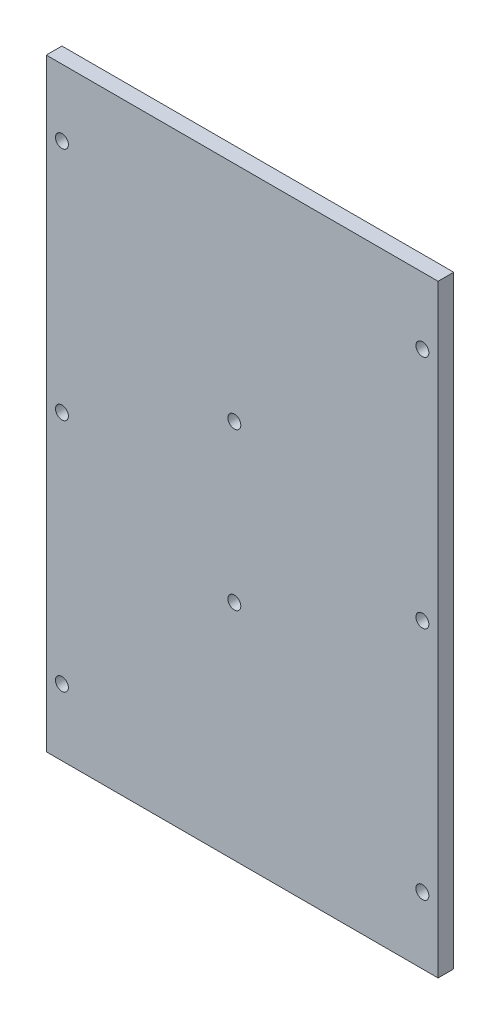
ISO-10303-21;
HEADER;
FILE_DESCRIPTION(('STEP AP214'),'2;1');
FILE_NAME('part.step','',(''),(''),'','','');
FILE_SCHEMA(('AUTOMOTIVE_DESIGN { 1 0 10303 214 1 1 1 1 }'));
ENDSEC;
DATA;
#1=APPLICATION_CONTEXT('core data for automotive mechanical design processes');
#2=APPLICATION_PROTOCOL_DEFINITION('international standard','automotive_design',2000,#1);
#3=PRODUCT_CONTEXT('',#1,'mechanical');
#4=PRODUCT('Part','Part','',(#3));
#5=PRODUCT_RELATED_PRODUCT_CATEGORY('part','',(#4));
#6=PRODUCT_DEFINITION_FORMATION('','',#4);
#7=PRODUCT_DEFINITION_CONTEXT('part definition',#1,'design');
#8=PRODUCT_DEFINITION('design','',#6,#7);
#9=PRODUCT_DEFINITION_SHAPE('','',#8);
#10=(LENGTH_UNIT() NAMED_UNIT(*) SI_UNIT(.MILLI.,.METRE.));
#11=(NAMED_UNIT(*) PLANE_ANGLE_UNIT() SI_UNIT($,.RADIAN.));
#12=(NAMED_UNIT(*) SI_UNIT($,.STERADIAN.) SOLID_ANGLE_UNIT());
#13=UNCERTAINTY_MEASURE_WITH_UNIT(LENGTH_MEASURE(1.E-05),#10,'distance_accuracy_value','');
#14=(GEOMETRIC_REPRESENTATION_CONTEXT(3) GLOBAL_UNCERTAINTY_ASSIGNED_CONTEXT((#13)) GLOBAL_UNIT_ASSIGNED_CONTEXT((#10,
#11,#12)) REPRESENTATION_CONTEXT('',''));
#15=CARTESIAN_POINT('',(0.,0.,0.));
#16=DIRECTION('',(0.,0.,1.));
#17=DIRECTION('',(1.,0.,0.));
#18=AXIS2_PLACEMENT_3D('',#15,#16,#17);
#19=CARTESIAN_POINT('',(-3.99999999999999,77.,4.));
#20=DIRECTION('',(0.,0.,-1.));
#21=DIRECTION('',(-1.,0.,0.));
#22=AXIS2_PLACEMENT_3D('',#19,#20,#21);
#23=CYLINDRICAL_SURFACE('',#22,1.65);
#24=CARTESIAN_POINT('',(-3.99999999999999,77.,4.));
#25=DIRECTION('',(0.,0.,-1.));
#26=DIRECTION('',(-1.,0.,0.));
#27=AXIS2_PLACEMENT_3D('',#24,#25,#26);
#28=CIRCLE('',#27,1.65);
#29=CARTESIAN_POINT('',(-5.64999999999999,77.,4.));
#30=VERTEX_POINT('',#29);
#31=EDGE_CURVE('E115',#30,#30,#28,.T.);
#32=ORIENTED_EDGE('',*,*,#31,.F.);
#33=EDGE_LOOP('',(#32));
#34=FACE_BOUND('',#33,.T.);
#35=CARTESIAN_POINT('',(-3.99999999999999,77.,1.5));
#36=DIRECTION('',(0.,0.,-1.));
#37=DIRECTION('',(-1.,0.,0.));
#38=AXIS2_PLACEMENT_3D('',#35,#36,#37);
#39=CIRCLE('',#38,1.65);
#40=CARTESIAN_POINT('',(-5.64999999999999,77.,1.5));
#41=VERTEX_POINT('',#40);
#42=EDGE_CURVE('E43',#41,#41,#39,.F.);
#43=ORIENTED_EDGE('',*,*,#42,.F.);
#44=EDGE_LOOP('',(#43));
#45=FACE_BOUND('',#44,.T.);
#46=ADVANCED_FACE('F39',(#34,#45),#23,.F.);
#47=CARTESIAN_POINT('',(-96.,17.,4.));
#48=DIRECTION('',(0.,0.,-1.));
#49=DIRECTION('',(-1.,0.,0.));
#50=AXIS2_PLACEMENT_3D('',#47,#48,#49);
#51=CYLINDRICAL_SURFACE('',#50,1.65);
#52=CARTESIAN_POINT('',(-96.,17.,4.));
#53=DIRECTION('',(0.,0.,-1.));
#54=DIRECTION('',(-1.,0.,0.));
#55=AXIS2_PLACEMENT_3D('',#52,#53,#54);
#56=CIRCLE('',#55,1.65);
#57=CARTESIAN_POINT('',(-97.65,17.,4.));
#58=VERTEX_POINT('',#57);
#59=EDGE_CURVE('E167',#58,#58,#56,.T.);
#60=ORIENTED_EDGE('',*,*,#59,.F.);
#61=EDGE_LOOP('',(#60));
#62=FACE_BOUND('',#61,.T.);
#63=CARTESIAN_POINT('',(-96.,17.,1.5));
#64=DIRECTION('',(0.,0.,-1.));
#65=DIRECTION('',(-1.,0.,0.));
#66=AXIS2_PLACEMENT_3D('',#63,#64,#65);
#67=CIRCLE('',#66,1.65);
#68=CARTESIAN_POINT('',(-97.65,17.,1.5));
#69=VERTEX_POINT('',#68);
#70=EDGE_CURVE('E137',#69,#69,#67,.F.);
#71=ORIENTED_EDGE('',*,*,#70,.F.);
#72=EDGE_LOOP('',(#71));
#73=FACE_BOUND('',#72,.T.);
#74=ADVANCED_FACE('F186',(#62,#73),#51,.F.);
#75=CARTESIAN_POINT('',(-52.,97.,4.));
#76=DIRECTION('',(0.,0.,-1.));
#77=DIRECTION('',(-1.,0.,0.));
#78=AXIS2_PLACEMENT_3D('',#75,#76,#77);
#79=CYLINDRICAL_SURFACE('',#78,1.65);
#80=CARTESIAN_POINT('',(-52.,97.,4.));
#81=DIRECTION('',(0.,0.,-1.));
#82=DIRECTION('',(-1.,0.,0.));
#83=AXIS2_PLACEMENT_3D('',#80,#81,#82);
#84=CIRCLE('',#83,1.65);
#85=CARTESIAN_POINT('',(-53.65,97.,4.));
#86=VERTEX_POINT('',#85);
#87=EDGE_CURVE('E164',#86,#86,#84,.T.);
#88=ORIENTED_EDGE('',*,*,#87,.F.);
#89=EDGE_LOOP('',(#88));
#90=FACE_BOUND('',#89,.T.);
#91=CARTESIAN_POINT('',(-52.,97.,1.5));
#92=DIRECTION('',(0.,0.,-1.));
#93=DIRECTION('',(-1.,0.,0.));
#94=AXIS2_PLACEMENT_3D('',#91,#92,#93);
#95=CIRCLE('',#94,1.65);
#96=CARTESIAN_POINT('',(-53.65,97.,1.5));
#97=VERTEX_POINT('',#96);
#98=EDGE_CURVE('E136',#97,#97,#95,.F.);
#99=ORIENTED_EDGE('',*,*,#98,.F.);
#100=EDGE_LOOP('',(#99));
#101=FACE_BOUND('',#100,.T.);
#102=ADVANCED_FACE('F194',(#90,#101),#79,.F.);
#103=CARTESIAN_POINT('',(-52.,57.,4.));
#104=DIRECTION('',(0.,0.,-1.));
#105=DIRECTION('',(-1.,0.,0.));
#106=AXIS2_PLACEMENT_3D('',#103,#104,#105);
#107=CYLINDRICAL_SURFACE('',#106,1.65);
#108=CARTESIAN_POINT('',(-52.,57.,4.));
#109=DIRECTION('',(0.,0.,-1.));
#110=DIRECTION('',(-1.,0.,0.));
#111=AXIS2_PLACEMENT_3D('',#108,#109,#110);
#112=CIRCLE('',#111,1.65);
#113=CARTESIAN_POINT('',(-53.65,57.,4.));
#114=VERTEX_POINT('',#113);
#115=EDGE_CURVE('E165',#114,#114,#112,.T.);
#116=ORIENTED_EDGE('',*,*,#115,.F.);
#117=EDGE_LOOP('',(#116));
#118=FACE_BOUND('',#117,.T.);
#119=CARTESIAN_POINT('',(-52.,57.,1.5));
#120=DIRECTION('',(0.,0.,-1.));
#121=DIRECTION('',(-1.,0.,0.));
#122=AXIS2_PLACEMENT_3D('',#119,#120,#121);
#123=CIRCLE('',#122,1.65);
#124=CARTESIAN_POINT('',(-53.65,57.,1.5));
#125=VERTEX_POINT('',#124);
#126=EDGE_CURVE('E135',#125,#125,#123,.F.);
#127=ORIENTED_EDGE('',*,*,#126,.F.);
#128=EDGE_LOOP('',(#127));
#129=FACE_BOUND('',#128,.T.);
#130=ADVANCED_FACE('F244',(#118,#129),#107,.F.);
#131=CARTESIAN_POINT('',(-96.,77.,4.));
#132=DIRECTION('',(0.,0.,-1.));
#133=DIRECTION('',(-1.,0.,0.));
#134=AXIS2_PLACEMENT_3D('',#131,#132,#133);
#135=CYLINDRICAL_SURFACE('',#134,1.65);
#136=CARTESIAN_POINT('',(-96.,77.,4.));
#137=DIRECTION('',(0.,0.,-1.));
#138=DIRECTION('',(-1.,0.,0.));
#139=AXIS2_PLACEMENT_3D('',#136,#137,#138);
#140=CIRCLE('',#139,1.65);
#141=CARTESIAN_POINT('',(-97.65,77.,4.));
#142=VERTEX_POINT('',#141);
#143=EDGE_CURVE('E166',#142,#142,#140,.T.);
#144=ORIENTED_EDGE('',*,*,#143,.F.);
#145=EDGE_LOOP('',(#144));
#146=FACE_BOUND('',#145,.T.);
#147=CARTESIAN_POINT('',(-96.,77.,1.5));
#148=DIRECTION('',(0.,0.,-1.));
#149=DIRECTION('',(-1.,0.,0.));
#150=AXIS2_PLACEMENT_3D('',#147,#148,#149);
#151=CIRCLE('',#150,1.65);
#152=CARTESIAN_POINT('',(-97.65,77.,1.5));
#153=VERTEX_POINT('',#152);
#154=EDGE_CURVE('E128',#153,#153,#151,.F.);
#155=ORIENTED_EDGE('',*,*,#154,.F.);
#156=EDGE_LOOP('',(#155));
#157=FACE_BOUND('',#156,.T.);
#158=ADVANCED_FACE('F199',(#146,#157),#135,.F.);
#159=CARTESIAN_POINT('',(-96.,137.,4.));
#160=DIRECTION('',(0.,0.,-1.));
#161=DIRECTION('',(-1.,0.,0.));
#162=AXIS2_PLACEMENT_3D('',#159,#160,#161);
#163=CYLINDRICAL_SURFACE('',#162,1.65000000000001);
#164=CARTESIAN_POINT('',(-96.,137.,4.));
#165=DIRECTION('',(0.,0.,-1.));
#166=DIRECTION('',(-1.,0.,0.));
#167=AXIS2_PLACEMENT_3D('',#164,#165,#166);
#168=CIRCLE('',#167,1.65000000000001);
#169=CARTESIAN_POINT('',(-97.65,137.,4.));
#170=VERTEX_POINT('',#169);
#171=EDGE_CURVE('E177',#170,#170,#168,.T.);
#172=ORIENTED_EDGE('',*,*,#171,.F.);
#173=EDGE_LOOP('',(#172));
#174=FACE_BOUND('',#173,.T.);
#175=CARTESIAN_POINT('',(-96.,137.,1.5));
#176=DIRECTION('',(0.,0.,-1.));
#177=DIRECTION('',(-1.,0.,0.));
#178=AXIS2_PLACEMENT_3D('',#175,#176,#177);
#179=CIRCLE('',#178,1.65000000000001);
#180=CARTESIAN_POINT('',(-97.65,137.,1.5));
#181=VERTEX_POINT('',#180);
#182=EDGE_CURVE('E130',#181,#181,#179,.F.);
#183=ORIENTED_EDGE('',*,*,#182,.F.);
#184=EDGE_LOOP('',(#183));
#185=FACE_BOUND('',#184,.T.);
#186=ADVANCED_FACE('F231',(#174,#185),#163,.F.);
#187=CARTESIAN_POINT('',(-3.99999999999998,137.,4.));
#188=DIRECTION('',(0.,0.,-1.));
#189=DIRECTION('',(-1.,0.,0.));
#190=AXIS2_PLACEMENT_3D('',#187,#188,#189);
#191=CYLINDRICAL_SURFACE('',#190,1.65000000000001);
#192=CARTESIAN_POINT('',(-3.99999999999998,137.,4.));
#193=DIRECTION('',(0.,0.,-1.));
#194=DIRECTION('',(-1.,0.,0.));
#195=AXIS2_PLACEMENT_3D('',#192,#193,#194);
#196=CIRCLE('',#195,1.65000000000001);
#197=CARTESIAN_POINT('',(-5.64999999999999,137.,4.));
#198=VERTEX_POINT('',#197);
#199=EDGE_CURVE('E173',#198,#198,#196,.T.);
#200=ORIENTED_EDGE('',*,*,#199,.F.);
#201=EDGE_LOOP('',(#200));
#202=FACE_BOUND('',#201,.T.);
#203=CARTESIAN_POINT('',(-3.99999999999998,137.,1.5));
#204=DIRECTION('',(0.,0.,-1.));
#205=DIRECTION('',(-1.,0.,0.));
#206=AXIS2_PLACEMENT_3D('',#203,#204,#205);
#207=CIRCLE('',#206,1.65000000000001);
#208=CARTESIAN_POINT('',(-5.64999999999999,137.,1.5));
#209=VERTEX_POINT('',#208);
#210=EDGE_CURVE('E122',#209,#209,#207,.F.);
#211=ORIENTED_EDGE('',*,*,#210,.F.);
#212=EDGE_LOOP('',(#211));
#213=FACE_BOUND('',#212,.T.);
#214=ADVANCED_FACE('F224',(#202,#213),#191,.F.);
#215=CARTESIAN_POINT('',(-4.,17.,4.));
#216=DIRECTION('',(0.,0.,-1.));
#217=DIRECTION('',(-1.,0.,0.));
#218=AXIS2_PLACEMENT_3D('',#215,#216,#217);
#219=CYLINDRICAL_SURFACE('',#218,1.65);
#220=CARTESIAN_POINT('',(-4.,17.,4.));
#221=DIRECTION('',(0.,0.,-1.));
#222=DIRECTION('',(-1.,0.,0.));
#223=AXIS2_PLACEMENT_3D('',#220,#221,#222);
#224=CIRCLE('',#223,1.65);
#225=CARTESIAN_POINT('',(-5.65,17.,4.));
#226=VERTEX_POINT('',#225);
#227=EDGE_CURVE('E174',#226,#226,#224,.T.);
#228=ORIENTED_EDGE('',*,*,#227,.F.);
#229=EDGE_LOOP('',(#228));
#230=FACE_BOUND('',#229,.T.);
#231=CARTESIAN_POINT('',(-4.,17.,1.5));
#232=DIRECTION('',(0.,0.,-1.));
#233=DIRECTION('',(-1.,0.,0.));
#234=AXIS2_PLACEMENT_3D('',#231,#232,#233);
#235=CIRCLE('',#234,1.65);
#236=CARTESIAN_POINT('',(-5.65,17.,1.5));
#237=VERTEX_POINT('',#236);
#238=EDGE_CURVE('E118',#237,#237,#235,.F.);
#239=ORIENTED_EDGE('',*,*,#238,.F.);
#240=EDGE_LOOP('',(#239));
#241=FACE_BOUND('',#240,.T.);
#242=ADVANCED_FACE('F217',(#230,#241),#219,.F.);
#243=CARTESIAN_POINT('',(0.,0.,4.));
#244=DIRECTION('',(0.,1.,0.));
#245=DIRECTION('',(0.,0.,1.));
#246=AXIS2_PLACEMENT_3D('',#243,#244,#245);
#247=PLANE('',#246);
#248=DIRECTION('',(1.,0.,0.));
#249=VECTOR('',#248,1.);
#250=CARTESIAN_POINT('',(0.,0.,0.));
#251=LINE('',#250,#249);
#252=CARTESIAN_POINT('',(-100.,0.,0.));
#253=VERTEX_POINT('',#252);
#254=CARTESIAN_POINT('',(0.,0.,0.));
#255=VERTEX_POINT('',#254);
#256=EDGE_CURVE('E108',#253,#255,#251,.T.);
#257=ORIENTED_EDGE('',*,*,#256,.T.);
#258=DIRECTION('',(0.,0.,-1.));
#259=VECTOR('',#258,1.);
#260=CARTESIAN_POINT('',(0.,0.,4.));
#261=LINE('',#260,#259);
#262=CARTESIAN_POINT('',(0.,0.,4.));
#263=VERTEX_POINT('',#262);
#264=EDGE_CURVE('E99',#263,#255,#261,.T.);
#265=ORIENTED_EDGE('',*,*,#264,.F.);
#266=DIRECTION('',(1.,0.,0.));
#267=VECTOR('',#266,1.);
#268=CARTESIAN_POINT('',(0.,0.,4.));
#269=LINE('',#268,#267);
#270=CARTESIAN_POINT('',(-100.,0.,4.));
#271=VERTEX_POINT('',#270);
#272=EDGE_CURVE('E94',#271,#263,#269,.T.);
#273=ORIENTED_EDGE('',*,*,#272,.F.);
#274=DIRECTION('',(0.,0.,-1.));
#275=VECTOR('',#274,1.);
#276=CARTESIAN_POINT('',(-100.,0.,4.));
#277=LINE('',#276,#275);
#278=EDGE_CURVE('E104',#271,#253,#277,.T.);
#279=ORIENTED_EDGE('',*,*,#278,.T.);
#280=EDGE_LOOP('',(#257,#265,#273,#279));
#281=FACE_BOUND('',#280,.T.);
#282=ADVANCED_FACE('F41',(#281),#247,.F.);
#283=CARTESIAN_POINT('',(0.,0.,4.));
#284=DIRECTION('',(-1.,0.,0.));
#285=DIRECTION('',(0.,0.,1.));
#286=AXIS2_PLACEMENT_3D('',#283,#284,#285);
#287=PLANE('',#286);
#288=DIRECTION('',(0.,1.,0.));
#289=VECTOR('',#288,1.);
#290=CARTESIAN_POINT('',(0.,0.,0.));
#291=LINE('',#290,#289);
#292=CARTESIAN_POINT('',(0.,154.,0.));
#293=VERTEX_POINT('',#292);
#294=EDGE_CURVE('E97',#255,#293,#291,.T.);
#295=ORIENTED_EDGE('',*,*,#294,.T.);
#296=DIRECTION('',(0.,0.,-1.));
#297=VECTOR('',#296,1.);
#298=CARTESIAN_POINT('',(0.,154.,4.));
#299=LINE('',#298,#297);
#300=CARTESIAN_POINT('',(0.,154.,4.));
#301=VERTEX_POINT('',#300);
#302=EDGE_CURVE('E100',#301,#293,#299,.T.);
#303=ORIENTED_EDGE('',*,*,#302,.F.);
#304=DIRECTION('',(0.,1.,0.));
#305=VECTOR('',#304,1.);
#306=CARTESIAN_POINT('',(0.,0.,4.));
#307=LINE('',#306,#305);
#308=EDGE_CURVE('E90',#263,#301,#307,.T.);
#309=ORIENTED_EDGE('',*,*,#308,.F.);
#310=ORIENTED_EDGE('',*,*,#264,.T.);
#311=EDGE_LOOP('',(#295,#303,#309,#310));
#312=FACE_BOUND('',#311,.T.);
#313=ADVANCED_FACE('F98',(#312),#287,.F.);
#314=CARTESIAN_POINT('',(0.,154.,4.));
#315=DIRECTION('',(0.,-1.,0.));
#316=DIRECTION('',(0.,0.,-1.));
#317=AXIS2_PLACEMENT_3D('',#314,#315,#316);
#318=PLANE('',#317);
#319=DIRECTION('',(-1.,0.,0.));
#320=VECTOR('',#319,1.);
#321=CARTESIAN_POINT('',(0.,154.,0.));
#322=LINE('',#321,#320);
#323=CARTESIAN_POINT('',(-100.,154.,0.));
#324=VERTEX_POINT('',#323);
#325=EDGE_CURVE('E73',#293,#324,#322,.T.);
#326=ORIENTED_EDGE('',*,*,#325,.T.);
#327=DIRECTION('',(0.,0.,-1.));
#328=VECTOR('',#327,1.);
#329=CARTESIAN_POINT('',(-100.,154.,4.));
#330=LINE('',#329,#328);
#331=CARTESIAN_POINT('',(-100.,154.,4.));
#332=VERTEX_POINT('',#331);
#333=EDGE_CURVE('E101',#332,#324,#330,.T.);
#334=ORIENTED_EDGE('',*,*,#333,.F.);
#335=DIRECTION('',(-1.,0.,0.));
#336=VECTOR('',#335,1.);
#337=CARTESIAN_POINT('',(0.,154.,4.));
#338=LINE('',#337,#336);
#339=EDGE_CURVE('E95',#301,#332,#338,.T.);
#340=ORIENTED_EDGE('',*,*,#339,.F.);
#341=ORIENTED_EDGE('',*,*,#302,.T.);
#342=EDGE_LOOP('',(#326,#334,#340,#341));
#343=FACE_BOUND('',#342,.T.);
#344=ADVANCED_FACE('F103',(#343),#318,.F.);
#345=CARTESIAN_POINT('',(-100.,0.,4.));
#346=DIRECTION('',(1.,0.,0.));
#347=DIRECTION('',(0.,0.,-1.));
#348=AXIS2_PLACEMENT_3D('',#345,#346,#347);
#349=PLANE('',#348);
#350=DIRECTION('',(0.,-1.,0.));
#351=VECTOR('',#350,1.);
#352=CARTESIAN_POINT('',(-100.,0.,0.));
#353=LINE('',#352,#351);
#354=EDGE_CURVE('E81',#324,#253,#353,.T.);
#355=ORIENTED_EDGE('',*,*,#354,.T.);
#356=ORIENTED_EDGE('',*,*,#278,.F.);
#357=DIRECTION('',(0.,-1.,0.));
#358=VECTOR('',#357,1.);
#359=CARTESIAN_POINT('',(-100.,0.,4.));
#360=LINE('',#359,#358);
#361=EDGE_CURVE('E59',#332,#271,#360,.T.);
#362=ORIENTED_EDGE('',*,*,#361,.F.);
#363=ORIENTED_EDGE('',*,*,#333,.T.);
#364=EDGE_LOOP('',(#355,#356,#362,#363));
#365=FACE_BOUND('',#364,.T.);
#366=ADVANCED_FACE('F202',(#365),#349,.F.);
#367=CARTESIAN_POINT('',(0.,0.,4.));
#368=DIRECTION('',(0.,0.,-1.));
#369=DIRECTION('',(-1.,0.,0.));
#370=AXIS2_PLACEMENT_3D('',#367,#368,#369);
#371=PLANE('',#370);
#372=ORIENTED_EDGE('',*,*,#227,.T.);
#373=EDGE_LOOP('',(#372));
#374=FACE_BOUND('',#373,.T.);
#375=ORIENTED_EDGE('',*,*,#199,.T.);
#376=EDGE_LOOP('',(#375));
#377=FACE_BOUND('',#376,.T.);
#378=ORIENTED_EDGE('',*,*,#171,.T.);
#379=EDGE_LOOP('',(#378));
#380=FACE_BOUND('',#379,.T.);
#381=ORIENTED_EDGE('',*,*,#143,.T.);
#382=EDGE_LOOP('',(#381));
#383=FACE_BOUND('',#382,.T.);
#384=ORIENTED_EDGE('',*,*,#115,.T.);
#385=EDGE_LOOP('',(#384));
#386=FACE_BOUND('',#385,.T.);
#387=ORIENTED_EDGE('',*,*,#87,.T.);
#388=EDGE_LOOP('',(#387));
#389=FACE_BOUND('',#388,.T.);
#390=ORIENTED_EDGE('',*,*,#59,.T.);
#391=EDGE_LOOP('',(#390));
#392=FACE_BOUND('',#391,.T.);
#393=ORIENTED_EDGE('',*,*,#31,.T.);
#394=EDGE_LOOP('',(#393));
#395=FACE_BOUND('',#394,.T.);
#396=ORIENTED_EDGE('',*,*,#272,.T.);
#397=ORIENTED_EDGE('',*,*,#308,.T.);
#398=ORIENTED_EDGE('',*,*,#339,.T.);
#399=ORIENTED_EDGE('',*,*,#361,.T.);
#400=EDGE_LOOP('',(#396,#397,#398,#399));
#401=FACE_BOUND('',#400,.T.);
#402=ADVANCED_FACE('F89',(#374,#377,#380,#383,#386,#389,#392,#395,#401),#371,.F.);
#403=CARTESIAN_POINT('',(0.,0.,0.));
#404=DIRECTION('',(0.,0.,-1.));
#405=DIRECTION('',(-1.,0.,0.));
#406=AXIS2_PLACEMENT_3D('',#403,#404,#405);
#407=PLANE('',#406);
#408=CARTESIAN_POINT('',(-4.,17.,0.));
#409=DIRECTION('',(0.,0.,-1.));
#410=DIRECTION('',(-1.,0.,0.));
#411=AXIS2_PLACEMENT_3D('',#408,#409,#410);
#412=CIRCLE('',#411,3.);
#413=CARTESIAN_POINT('',(-7.,17.,0.));
#414=VERTEX_POINT('',#413);
#415=EDGE_CURVE('E376',#414,#414,#412,.T.);
#416=ORIENTED_EDGE('',*,*,#415,.F.);
#417=EDGE_LOOP('',(#416));
#418=FACE_BOUND('',#417,.T.);
#419=CARTESIAN_POINT('',(-3.99999999999999,77.,0.));
#420=DIRECTION('',(0.,0.,-1.));
#421=DIRECTION('',(-1.,0.,0.));
#422=AXIS2_PLACEMENT_3D('',#419,#420,#421);
#423=CIRCLE('',#422,3.);
#424=CARTESIAN_POINT('',(-6.99999999999999,77.,0.));
#425=VERTEX_POINT('',#424);
#426=EDGE_CURVE('E398',#425,#425,#423,.T.);
#427=ORIENTED_EDGE('',*,*,#426,.F.);
#428=EDGE_LOOP('',(#427));
#429=FACE_BOUND('',#428,.T.);
#430=CARTESIAN_POINT('',(-96.,77.,0.));
#431=DIRECTION('',(0.,0.,-1.));
#432=DIRECTION('',(-1.,0.,0.));
#433=AXIS2_PLACEMENT_3D('',#430,#431,#432);
#434=CIRCLE('',#433,3.00000000000001);
#435=CARTESIAN_POINT('',(-99.,77.,0.));
#436=VERTEX_POINT('',#435);
#437=EDGE_CURVE('E357',#436,#436,#434,.T.);
#438=ORIENTED_EDGE('',*,*,#437,.F.);
#439=EDGE_LOOP('',(#438));
#440=FACE_BOUND('',#439,.T.);
#441=CARTESIAN_POINT('',(-96.,137.,0.));
#442=DIRECTION('',(0.,0.,-1.));
#443=DIRECTION('',(-1.,0.,0.));
#444=AXIS2_PLACEMENT_3D('',#441,#442,#443);
#445=CIRCLE('',#444,3.00000000000001);
#446=CARTESIAN_POINT('',(-99.,137.,0.));
#447=VERTEX_POINT('',#446);
#448=EDGE_CURVE('E358',#447,#447,#445,.T.);
#449=ORIENTED_EDGE('',*,*,#448,.F.);
#450=EDGE_LOOP('',(#449));
#451=FACE_BOUND('',#450,.T.);
#452=CARTESIAN_POINT('',(-52.,97.,0.));
#453=DIRECTION('',(0.,0.,-1.));
#454=DIRECTION('',(-1.,0.,0.));
#455=AXIS2_PLACEMENT_3D('',#452,#453,#454);
#456=CIRCLE('',#455,3.);
#457=CARTESIAN_POINT('',(-55.,97.,0.));
#458=VERTEX_POINT('',#457);
#459=EDGE_CURVE('E420',#458,#458,#456,.T.);
#460=ORIENTED_EDGE('',*,*,#459,.F.);
#461=EDGE_LOOP('',(#460));
#462=FACE_BOUND('',#461,.T.);
#463=CARTESIAN_POINT('',(-52.,57.,0.));
#464=DIRECTION('',(0.,0.,-1.));
#465=DIRECTION('',(-1.,0.,0.));
#466=AXIS2_PLACEMENT_3D('',#463,#464,#465);
#467=CIRCLE('',#466,3.);
#468=CARTESIAN_POINT('',(-55.,57.,0.));
#469=VERTEX_POINT('',#468);
#470=EDGE_CURVE('E421',#469,#469,#467,.T.);
#471=ORIENTED_EDGE('',*,*,#470,.F.);
#472=EDGE_LOOP('',(#471));
#473=FACE_BOUND('',#472,.T.);
#474=CARTESIAN_POINT('',(-3.99999999999998,137.,0.));
#475=DIRECTION('',(0.,0.,-1.));
#476=DIRECTION('',(-1.,0.,0.));
#477=AXIS2_PLACEMENT_3D('',#474,#475,#476);
#478=CIRCLE('',#477,3.);
#479=CARTESIAN_POINT('',(-6.99999999999999,137.,0.));
#480=VERTEX_POINT('',#479);
#481=EDGE_CURVE('E367',#480,#480,#478,.T.);
#482=ORIENTED_EDGE('',*,*,#481,.F.);
#483=EDGE_LOOP('',(#482));
#484=FACE_BOUND('',#483,.T.);
#485=CARTESIAN_POINT('',(-96.,17.,0.));
#486=DIRECTION('',(0.,0.,-1.));
#487=DIRECTION('',(-1.,0.,0.));
#488=AXIS2_PLACEMENT_3D('',#485,#486,#487);
#489=CIRCLE('',#488,3.00000000000001);
#490=CARTESIAN_POINT('',(-99.,17.,0.));
#491=VERTEX_POINT('',#490);
#492=EDGE_CURVE('E373',#491,#491,#489,.T.);
#493=ORIENTED_EDGE('',*,*,#492,.F.);
#494=EDGE_LOOP('',(#493));
#495=FACE_BOUND('',#494,.T.);
#496=CARTESIAN_POINT('',(-85.,139.,0.));
#497=DIRECTION('',(0.,0.,-1.));
#498=DIRECTION('',(-1.,0.,0.));
#499=AXIS2_PLACEMENT_3D('',#496,#497,#498);
#500=CIRCLE('',#499,7.50000000000001);
#501=CARTESIAN_POINT('',(-92.5,139.,0.));
#502=VERTEX_POINT('',#501);
#503=EDGE_CURVE('E11',#502,#502,#500,.T.);
#504=ORIENTED_EDGE('',*,*,#503,.F.);
#505=EDGE_LOOP('',(#504));
#506=FACE_BOUND('',#505,.T.);
#507=CARTESIAN_POINT('',(-15.,139.,0.));
#508=DIRECTION('',(0.,0.,-1.));
#509=DIRECTION('',(-1.,0.,0.));
#510=AXIS2_PLACEMENT_3D('',#507,#508,#509);
#511=CIRCLE('',#510,7.5);
#512=CARTESIAN_POINT('',(-22.5,139.,0.));
#513=VERTEX_POINT('',#512);
#514=EDGE_CURVE('E47',#513,#513,#511,.T.);
#515=ORIENTED_EDGE('',*,*,#514,.F.);
#516=EDGE_LOOP('',(#515));
#517=FACE_BOUND('',#516,.T.);
#518=CARTESIAN_POINT('',(-15.,15.,0.));
#519=DIRECTION('',(0.,0.,-1.));
#520=DIRECTION('',(-1.,0.,0.));
#521=AXIS2_PLACEMENT_3D('',#518,#519,#520);
#522=CIRCLE('',#521,7.5);
#523=CARTESIAN_POINT('',(-22.5,15.,0.));
#524=VERTEX_POINT('',#523);
#525=EDGE_CURVE('E158',#524,#524,#522,.T.);
#526=ORIENTED_EDGE('',*,*,#525,.F.);
#527=EDGE_LOOP('',(#526));
#528=FACE_BOUND('',#527,.T.);
#529=CARTESIAN_POINT('',(-85.,15.,0.));
#530=DIRECTION('',(0.,0.,-1.));
#531=DIRECTION('',(-1.,0.,0.));
#532=AXIS2_PLACEMENT_3D('',#529,#530,#531);
#533=CIRCLE('',#532,7.5);
#534=CARTESIAN_POINT('',(-92.5,15.,0.));
#535=VERTEX_POINT('',#534);
#536=EDGE_CURVE('E116',#535,#535,#533,.T.);
#537=ORIENTED_EDGE('',*,*,#536,.F.);
#538=EDGE_LOOP('',(#537));
#539=FACE_BOUND('',#538,.T.);
#540=ORIENTED_EDGE('',*,*,#256,.F.);
#541=ORIENTED_EDGE('',*,*,#354,.F.);
#542=ORIENTED_EDGE('',*,*,#325,.F.);
#543=ORIENTED_EDGE('',*,*,#294,.F.);
#544=EDGE_LOOP('',(#540,#541,#542,#543));
#545=FACE_BOUND('',#544,.T.);
#546=ADVANCED_FACE('F204',(#418,#429,#440,#451,#462,#473,#484,#495,#506,#517,#528,#539,#545),
#407,.T.);
#547=CARTESIAN_POINT('',(-85.,15.,0.));
#548=DIRECTION('',(0.,0.,1.));
#549=DIRECTION('',(-1.,0.,0.));
#550=AXIS2_PLACEMENT_3D('',#547,#548,#549);
#551=CONICAL_SURFACE('',#550,7.5,0.26179938779915);
#552=CARTESIAN_POINT('',(-85.,15.,-6.));
#553=DIRECTION('',(0.,0.,-1.));
#554=DIRECTION('',(-1.,0.,0.));
#555=AXIS2_PLACEMENT_3D('',#552,#553,#554);
#556=CIRCLE('',#555,5.89230484541326);
#557=CARTESIAN_POINT('',(-90.8923048454133,15.,-6.));
#558=VERTEX_POINT('',#557);
#559=EDGE_CURVE('E157',#558,#558,#556,.T.);
#560=ORIENTED_EDGE('',*,*,#559,.F.);
#561=EDGE_LOOP('',(#560));
#562=FACE_BOUND('',#561,.T.);
#563=ORIENTED_EDGE('',*,*,#536,.T.);
#564=EDGE_LOOP('',(#563));
#565=FACE_BOUND('',#564,.T.);
#566=ADVANCED_FACE('F207',(#562,#565),#551,.T.);
#567=CARTESIAN_POINT('',(-85.,15.,-6.));
#568=DIRECTION('',(0.,0.,-1.));
#569=DIRECTION('',(-1.,0.,0.));
#570=AXIS2_PLACEMENT_3D('',#567,#568,#569);
#571=PLANE('',#570);
#572=ORIENTED_EDGE('',*,*,#559,.T.);
#573=EDGE_LOOP('',(#572));
#574=FACE_BOUND('',#573,.T.);
#575=ADVANCED_FACE('F282',(#574),#571,.T.);
#576=CARTESIAN_POINT('',(-15.,15.,0.));
#577=DIRECTION('',(0.,0.,1.));
#578=DIRECTION('',(-1.,0.,0.));
#579=AXIS2_PLACEMENT_3D('',#576,#577,#578);
#580=CONICAL_SURFACE('',#579,7.5,0.26179938779915);
#581=CARTESIAN_POINT('',(-15.,15.,-6.));
#582=DIRECTION('',(0.,0.,-1.));
#583=DIRECTION('',(-1.,0.,0.));
#584=AXIS2_PLACEMENT_3D('',#581,#582,#583);
#585=CIRCLE('',#584,5.89230484541326);
#586=CARTESIAN_POINT('',(-20.8923048454133,15.,-6.));
#587=VERTEX_POINT('',#586);
#588=EDGE_CURVE('E155',#587,#587,#585,.T.);
#589=ORIENTED_EDGE('',*,*,#588,.F.);
#590=EDGE_LOOP('',(#589));
#591=FACE_BOUND('',#590,.T.);
#592=ORIENTED_EDGE('',*,*,#525,.T.);
#593=EDGE_LOOP('',(#592));
#594=FACE_BOUND('',#593,.T.);
#595=ADVANCED_FACE('F280',(#591,#594),#580,.T.);
#596=CARTESIAN_POINT('',(-15.,15.,-6.));
#597=DIRECTION('',(0.,0.,-1.));
#598=DIRECTION('',(-1.,0.,0.));
#599=AXIS2_PLACEMENT_3D('',#596,#597,#598);
#600=PLANE('',#599);
#601=ORIENTED_EDGE('',*,*,#588,.T.);
#602=EDGE_LOOP('',(#601));
#603=FACE_BOUND('',#602,.T.);
#604=ADVANCED_FACE('F278',(#603),#600,.T.);
#605=CARTESIAN_POINT('',(-15.,139.,0.));
#606=DIRECTION('',(0.,0.,1.));
#607=DIRECTION('',(-1.,0.,0.));
#608=AXIS2_PLACEMENT_3D('',#605,#606,#607);
#609=CONICAL_SURFACE('',#608,7.5,0.26179938779915);
#610=CARTESIAN_POINT('',(-15.,139.,-6.));
#611=DIRECTION('',(0.,0.,-1.));
#612=DIRECTION('',(-1.,0.,0.));
#613=AXIS2_PLACEMENT_3D('',#610,#611,#612);
#614=CIRCLE('',#613,5.89230484541326);
#615=CARTESIAN_POINT('',(-20.8923048454132,139.,-6.));
#616=VERTEX_POINT('',#615);
#617=EDGE_CURVE('E150',#616,#616,#614,.T.);
#618=ORIENTED_EDGE('',*,*,#617,.F.);
#619=EDGE_LOOP('',(#618));
#620=FACE_BOUND('',#619,.T.);
#621=ORIENTED_EDGE('',*,*,#514,.T.);
#622=EDGE_LOOP('',(#621));
#623=FACE_BOUND('',#622,.T.);
#624=ADVANCED_FACE('F283',(#620,#623),#609,.T.);
#625=CARTESIAN_POINT('',(-15.,139.,-6.));
#626=DIRECTION('',(0.,0.,-1.));
#627=DIRECTION('',(-1.,0.,0.));
#628=AXIS2_PLACEMENT_3D('',#625,#626,#627);
#629=PLANE('',#628);
#630=ORIENTED_EDGE('',*,*,#617,.T.);
#631=EDGE_LOOP('',(#630));
#632=FACE_BOUND('',#631,.T.);
#633=ADVANCED_FACE('F288',(#632),#629,.T.);
#634=CARTESIAN_POINT('',(-85.,139.,0.));
#635=DIRECTION('',(0.,0.,1.));
#636=DIRECTION('',(-1.,0.,0.));
#637=AXIS2_PLACEMENT_3D('',#634,#635,#636);
#638=CONICAL_SURFACE('',#637,7.50000000000001,0.26179938779915);
#639=CARTESIAN_POINT('',(-85.,139.,-6.));
#640=DIRECTION('',(0.,0.,-1.));
#641=DIRECTION('',(-1.,0.,0.));
#642=AXIS2_PLACEMENT_3D('',#639,#640,#641);
#643=CIRCLE('',#642,5.89230484541327);
#644=CARTESIAN_POINT('',(-90.8923048454133,139.,-6.));
#645=VERTEX_POINT('',#644);
#646=EDGE_CURVE('E141',#645,#645,#643,.T.);
#647=ORIENTED_EDGE('',*,*,#646,.F.);
#648=EDGE_LOOP('',(#647));
#649=FACE_BOUND('',#648,.T.);
#650=ORIENTED_EDGE('',*,*,#503,.T.);
#651=EDGE_LOOP('',(#650));
#652=FACE_BOUND('',#651,.T.);
#653=ADVANCED_FACE('F291',(#649,#652),#638,.T.);
#654=CARTESIAN_POINT('',(-85.,139.,-6.));
#655=DIRECTION('',(0.,0.,-1.));
#656=DIRECTION('',(-1.,0.,0.));
#657=AXIS2_PLACEMENT_3D('',#654,#655,#656);
#658=PLANE('',#657);
#659=ORIENTED_EDGE('',*,*,#646,.T.);
#660=EDGE_LOOP('',(#659));
#661=FACE_BOUND('',#660,.T.);
#662=ADVANCED_FACE('F299',(#661),#658,.T.);
#663=CARTESIAN_POINT('',(-4.,17.,1.5));
#664=DIRECTION('',(0.,0.,-1.));
#665=DIRECTION('',(-1.,0.,0.));
#666=AXIS2_PLACEMENT_3D('',#663,#664,#665);
#667=PLANE('',#666);
#668=CARTESIAN_POINT('',(-4.,17.,1.5));
#669=DIRECTION('',(0.,0.,-1.));
#670=DIRECTION('',(-1.,0.,0.));
#671=AXIS2_PLACEMENT_3D('',#668,#669,#670);
#672=CIRCLE('',#671,3.);
#673=CARTESIAN_POINT('',(-7.,17.,1.5));
#674=VERTEX_POINT('',#673);
#675=EDGE_CURVE('E391',#674,#674,#672,.T.);
#676=ORIENTED_EDGE('',*,*,#675,.T.);
#677=EDGE_LOOP('',(#676));
#678=FACE_BOUND('',#677,.T.);
#679=ORIENTED_EDGE('',*,*,#238,.T.);
#680=EDGE_LOOP('',(#679));
#681=FACE_BOUND('',#680,.T.);
#682=ADVANCED_FACE('F298',(#678,#681),#667,.T.);
#683=CARTESIAN_POINT('',(-4.,17.,1.5));
#684=DIRECTION('',(0.,0.,-1.));
#685=DIRECTION('',(-1.,0.,0.));
#686=AXIS2_PLACEMENT_3D('',#683,#684,#685);
#687=CYLINDRICAL_SURFACE('',#686,3.);
#688=ORIENTED_EDGE('',*,*,#675,.F.);
#689=EDGE_LOOP('',(#688));
#690=FACE_BOUND('',#689,.T.);
#691=ORIENTED_EDGE('',*,*,#415,.T.);
#692=EDGE_LOOP('',(#691));
#693=FACE_BOUND('',#692,.T.);
#694=ADVANCED_FACE('F333',(#690,#693),#687,.F.);
#695=CARTESIAN_POINT('',(-3.99999999999998,137.,1.5));
#696=DIRECTION('',(0.,0.,-1.));
#697=DIRECTION('',(-1.,0.,0.));
#698=AXIS2_PLACEMENT_3D('',#695,#696,#697);
#699=PLANE('',#698);
#700=CARTESIAN_POINT('',(-3.99999999999998,137.,1.5));
#701=DIRECTION('',(0.,0.,-1.));
#702=DIRECTION('',(-1.,0.,0.));
#703=AXIS2_PLACEMENT_3D('',#700,#701,#702);
#704=CIRCLE('',#703,3.);
#705=CARTESIAN_POINT('',(-6.99999999999999,137.,1.5));
#706=VERTEX_POINT('',#705);
#707=EDGE_CURVE('E431',#706,#706,#704,.T.);
#708=ORIENTED_EDGE('',*,*,#707,.T.);
#709=EDGE_LOOP('',(#708));
#710=FACE_BOUND('',#709,.T.);
#711=ORIENTED_EDGE('',*,*,#210,.T.);
#712=EDGE_LOOP('',(#711));
#713=FACE_BOUND('',#712,.T.);
#714=ADVANCED_FACE('F261',(#710,#713),#699,.T.);
#715=CARTESIAN_POINT('',(-3.99999999999998,137.,1.5));
#716=DIRECTION('',(0.,0.,-1.));
#717=DIRECTION('',(-1.,0.,0.));
#718=AXIS2_PLACEMENT_3D('',#715,#716,#717);
#719=CYLINDRICAL_SURFACE('',#718,3.);
#720=ORIENTED_EDGE('',*,*,#707,.F.);
#721=EDGE_LOOP('',(#720));
#722=FACE_BOUND('',#721,.T.);
#723=ORIENTED_EDGE('',*,*,#481,.T.);
#724=EDGE_LOOP('',(#723));
#725=FACE_BOUND('',#724,.T.);
#726=ADVANCED_FACE('F253',(#722,#725),#719,.F.);
#727=CARTESIAN_POINT('',(-96.,137.,1.5));
#728=DIRECTION('',(0.,0.,-1.));
#729=DIRECTION('',(-1.,0.,0.));
#730=AXIS2_PLACEMENT_3D('',#727,#728,#729);
#731=PLANE('',#730);
#732=CARTESIAN_POINT('',(-96.,137.,1.5));
#733=DIRECTION('',(0.,0.,-1.));
#734=DIRECTION('',(-1.,0.,0.));
#735=AXIS2_PLACEMENT_3D('',#732,#733,#734);
#736=CIRCLE('',#735,3.00000000000001);
#737=CARTESIAN_POINT('',(-99.,137.,1.5));
#738=VERTEX_POINT('',#737);
#739=EDGE_CURVE('E364',#738,#738,#736,.T.);
#740=ORIENTED_EDGE('',*,*,#739,.T.);
#741=EDGE_LOOP('',(#740));
#742=FACE_BOUND('',#741,.T.);
#743=ORIENTED_EDGE('',*,*,#182,.T.);
#744=EDGE_LOOP('',(#743));
#745=FACE_BOUND('',#744,.T.);
#746=ADVANCED_FACE('F247',(#742,#745),#731,.T.);
#747=CARTESIAN_POINT('',(-96.,137.,1.5));
#748=DIRECTION('',(0.,0.,-1.));
#749=DIRECTION('',(-1.,0.,0.));
#750=AXIS2_PLACEMENT_3D('',#747,#748,#749);
#751=CYLINDRICAL_SURFACE('',#750,3.00000000000001);
#752=ORIENTED_EDGE('',*,*,#739,.F.);
#753=EDGE_LOOP('',(#752));
#754=FACE_BOUND('',#753,.T.);
#755=ORIENTED_EDGE('',*,*,#448,.T.);
#756=EDGE_LOOP('',(#755));
#757=FACE_BOUND('',#756,.T.);
#758=ADVANCED_FACE('F249',(#754,#757),#751,.F.);
#759=CARTESIAN_POINT('',(-96.,77.,1.5));
#760=DIRECTION('',(0.,0.,-1.));
#761=DIRECTION('',(-1.,0.,0.));
#762=AXIS2_PLACEMENT_3D('',#759,#760,#761);
#763=PLANE('',#762);
#764=CARTESIAN_POINT('',(-96.,77.,1.5));
#765=DIRECTION('',(0.,0.,-1.));
#766=DIRECTION('',(-1.,0.,0.));
#767=AXIS2_PLACEMENT_3D('',#764,#765,#766);
#768=CIRCLE('',#767,3.00000000000001);
#769=CARTESIAN_POINT('',(-99.,77.,1.5));
#770=VERTEX_POINT('',#769);
#771=EDGE_CURVE('E353',#770,#770,#768,.T.);
#772=ORIENTED_EDGE('',*,*,#771,.T.);
#773=EDGE_LOOP('',(#772));
#774=FACE_BOUND('',#773,.T.);
#775=ORIENTED_EDGE('',*,*,#154,.T.);
#776=EDGE_LOOP('',(#775));
#777=FACE_BOUND('',#776,.T.);
#778=ADVANCED_FACE('F256',(#774,#777),#763,.T.);
#779=CARTESIAN_POINT('',(-96.,77.,1.5));
#780=DIRECTION('',(0.,0.,-1.));
#781=DIRECTION('',(-1.,0.,0.));
#782=AXIS2_PLACEMENT_3D('',#779,#780,#781);
#783=CYLINDRICAL_SURFACE('',#782,3.00000000000001);
#784=ORIENTED_EDGE('',*,*,#771,.F.);
#785=EDGE_LOOP('',(#784));
#786=FACE_BOUND('',#785,.T.);
#787=ORIENTED_EDGE('',*,*,#437,.T.);
#788=EDGE_LOOP('',(#787));
#789=FACE_BOUND('',#788,.T.);
#790=ADVANCED_FACE('F319',(#786,#789),#783,.F.);
#791=CARTESIAN_POINT('',(-52.,57.,1.5));
#792=DIRECTION('',(0.,0.,-1.));
#793=DIRECTION('',(-1.,0.,0.));
#794=AXIS2_PLACEMENT_3D('',#791,#792,#793);
#795=PLANE('',#794);
#796=CARTESIAN_POINT('',(-52.,57.,1.5));
#797=DIRECTION('',(0.,0.,-1.));
#798=DIRECTION('',(-1.,0.,0.));
#799=AXIS2_PLACEMENT_3D('',#796,#797,#798);
#800=CIRCLE('',#799,3.);
#801=CARTESIAN_POINT('',(-55.,57.,1.5));
#802=VERTEX_POINT('',#801);
#803=EDGE_CURVE('E405',#802,#802,#800,.T.);
#804=ORIENTED_EDGE('',*,*,#803,.T.);
#805=EDGE_LOOP('',(#804));
#806=FACE_BOUND('',#805,.T.);
#807=ORIENTED_EDGE('',*,*,#126,.T.);
#808=EDGE_LOOP('',(#807));
#809=FACE_BOUND('',#808,.T.);
#810=ADVANCED_FACE('F320',(#806,#809),#795,.T.);
#811=CARTESIAN_POINT('',(-52.,57.,1.5));
#812=DIRECTION('',(0.,0.,-1.));
#813=DIRECTION('',(-1.,0.,0.));
#814=AXIS2_PLACEMENT_3D('',#811,#812,#813);
#815=CYLINDRICAL_SURFACE('',#814,3.);
#816=ORIENTED_EDGE('',*,*,#803,.F.);
#817=EDGE_LOOP('',(#816));
#818=FACE_BOUND('',#817,.T.);
#819=ORIENTED_EDGE('',*,*,#470,.T.);
#820=EDGE_LOOP('',(#819));
#821=FACE_BOUND('',#820,.T.);
#822=ADVANCED_FACE('F317',(#818,#821),#815,.F.);
#823=CARTESIAN_POINT('',(-52.,97.,1.5));
#824=DIRECTION('',(0.,0.,-1.));
#825=DIRECTION('',(-1.,0.,0.));
#826=AXIS2_PLACEMENT_3D('',#823,#824,#825);
#827=PLANE('',#826);
#828=CARTESIAN_POINT('',(-52.,97.,1.5));
#829=DIRECTION('',(0.,0.,-1.));
#830=DIRECTION('',(-1.,0.,0.));
#831=AXIS2_PLACEMENT_3D('',#828,#829,#830);
#832=CIRCLE('',#831,3.);
#833=CARTESIAN_POINT('',(-55.,97.,1.5));
#834=VERTEX_POINT('',#833);
#835=EDGE_CURVE('E436',#834,#834,#832,.T.);
#836=ORIENTED_EDGE('',*,*,#835,.T.);
#837=EDGE_LOOP('',(#836));
#838=FACE_BOUND('',#837,.T.);
#839=ORIENTED_EDGE('',*,*,#98,.T.);
#840=EDGE_LOOP('',(#839));
#841=FACE_BOUND('',#840,.T.);
#842=ADVANCED_FACE('F330',(#838,#841),#827,.T.);
#843=CARTESIAN_POINT('',(-52.,97.,1.5));
#844=DIRECTION('',(0.,0.,-1.));
#845=DIRECTION('',(-1.,0.,0.));
#846=AXIS2_PLACEMENT_3D('',#843,#844,#845);
#847=CYLINDRICAL_SURFACE('',#846,3.);
#848=ORIENTED_EDGE('',*,*,#835,.F.);
#849=EDGE_LOOP('',(#848));
#850=FACE_BOUND('',#849,.T.);
#851=ORIENTED_EDGE('',*,*,#459,.T.);
#852=EDGE_LOOP('',(#851));
#853=FACE_BOUND('',#852,.T.);
#854=ADVANCED_FACE('F271',(#850,#853),#847,.F.);
#855=CARTESIAN_POINT('',(-96.,17.,1.5));
#856=DIRECTION('',(0.,0.,-1.));
#857=DIRECTION('',(-1.,0.,0.));
#858=AXIS2_PLACEMENT_3D('',#855,#856,#857);
#859=PLANE('',#858);
#860=CARTESIAN_POINT('',(-96.,17.,1.5));
#861=DIRECTION('',(0.,0.,-1.));
#862=DIRECTION('',(-1.,0.,0.));
#863=AXIS2_PLACEMENT_3D('',#860,#861,#862);
#864=CIRCLE('',#863,3.00000000000001);
#865=CARTESIAN_POINT('',(-99.,17.,1.5));
#866=VERTEX_POINT('',#865);
#867=EDGE_CURVE('E123',#866,#866,#864,.T.);
#868=ORIENTED_EDGE('',*,*,#867,.T.);
#869=EDGE_LOOP('',(#868));
#870=FACE_BOUND('',#869,.T.);
#871=ORIENTED_EDGE('',*,*,#70,.T.);
#872=EDGE_LOOP('',(#871));
#873=FACE_BOUND('',#872,.T.);
#874=ADVANCED_FACE('F270',(#870,#873),#859,.T.);
#875=CARTESIAN_POINT('',(-96.,17.,1.5));
#876=DIRECTION('',(0.,0.,-1.));
#877=DIRECTION('',(-1.,0.,0.));
#878=AXIS2_PLACEMENT_3D('',#875,#876,#877);
#879=CYLINDRICAL_SURFACE('',#878,3.00000000000001);
#880=ORIENTED_EDGE('',*,*,#867,.F.);
#881=EDGE_LOOP('',(#880));
#882=FACE_BOUND('',#881,.T.);
#883=ORIENTED_EDGE('',*,*,#492,.T.);
#884=EDGE_LOOP('',(#883));
#885=FACE_BOUND('',#884,.T.);
#886=ADVANCED_FACE('F269',(#882,#885),#879,.F.);
#887=CARTESIAN_POINT('',(-3.99999999999999,77.,1.5));
#888=DIRECTION('',(0.,0.,-1.));
#889=DIRECTION('',(-1.,0.,0.));
#890=AXIS2_PLACEMENT_3D('',#887,#888,#889);
#891=PLANE('',#890);
#892=CARTESIAN_POINT('',(-3.99999999999999,77.,1.5));
#893=DIRECTION('',(0.,0.,-1.));
#894=DIRECTION('',(-1.,0.,0.));
#895=AXIS2_PLACEMENT_3D('',#892,#893,#894);
#896=CIRCLE('',#895,3.);
#897=CARTESIAN_POINT('',(-6.99999999999999,77.,1.5));
#898=VERTEX_POINT('',#897);
#899=EDGE_CURVE('E362',#898,#898,#896,.T.);
#900=ORIENTED_EDGE('',*,*,#899,.T.);
#901=EDGE_LOOP('',(#900));
#902=FACE_BOUND('',#901,.T.);
#903=ORIENTED_EDGE('',*,*,#42,.T.);
#904=EDGE_LOOP('',(#903));
#905=FACE_BOUND('',#904,.T.);
#906=ADVANCED_FACE('F274',(#902,#905),#891,.T.);
#907=CARTESIAN_POINT('',(-3.99999999999999,77.,1.5));
#908=DIRECTION('',(0.,0.,-1.));
#909=DIRECTION('',(-1.,0.,0.));
#910=AXIS2_PLACEMENT_3D('',#907,#908,#909);
#911=CYLINDRICAL_SURFACE('',#910,3.);
#912=ORIENTED_EDGE('',*,*,#899,.F.);
#913=EDGE_LOOP('',(#912));
#914=FACE_BOUND('',#913,.T.);
#915=ORIENTED_EDGE('',*,*,#426,.T.);
#916=EDGE_LOOP('',(#915));
#917=FACE_BOUND('',#916,.T.);
#918=ADVANCED_FACE('F345',(#914,#917),#911,.F.);
#919=CLOSED_SHELL('',(#46,#74,#102,#130,#158,#186,#214,#242,#282,#313,#344,#366,#402,#546,#566,
#575,#595,#604,#624,#633,#653,#662,#682,#694,#714,#726,#746,#758,#778,#790,#810,#822,#842,#854,
#874,#886,#906,#918));
#920=MANIFOLD_SOLID_BREP('B2',#919);
#921=ADVANCED_BREP_SHAPE_REPRESENTATION('',(#18,#920),#14);
#922=SHAPE_DEFINITION_REPRESENTATION(#9,#921);
ENDSEC;
END-ISO-10303-21;
